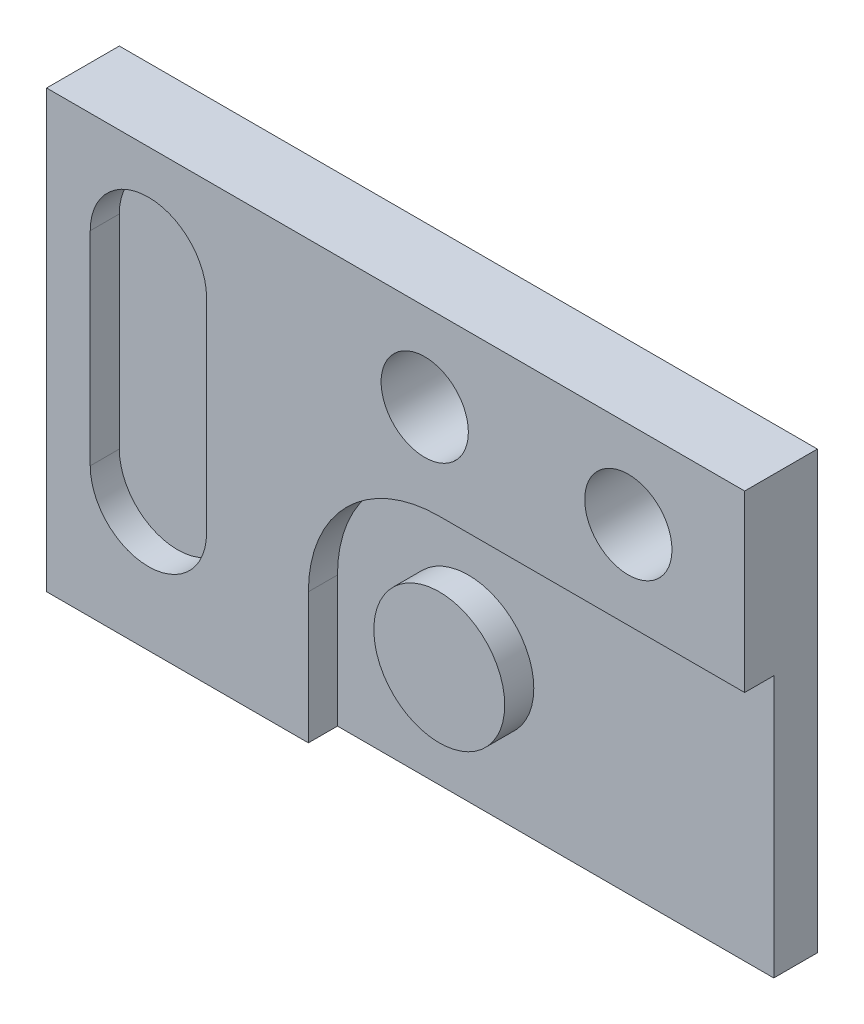
ISO-10303-21;
HEADER;
FILE_DESCRIPTION(('STEP AP214'),'2;1');
FILE_NAME('part.step','',(''),(''),'','','');
FILE_SCHEMA(('AUTOMOTIVE_DESIGN { 1 0 10303 214 1 1 1 1 }'));
ENDSEC;
DATA;
#1=APPLICATION_CONTEXT('core data for automotive mechanical design processes');
#2=APPLICATION_PROTOCOL_DEFINITION('international standard','automotive_design',2000,#1);
#3=PRODUCT_CONTEXT('',#1,'mechanical');
#4=PRODUCT('Part','Part','',(#3));
#5=PRODUCT_RELATED_PRODUCT_CATEGORY('part','',(#4));
#6=PRODUCT_DEFINITION_FORMATION('','',#4);
#7=PRODUCT_DEFINITION_CONTEXT('part definition',#1,'design');
#8=PRODUCT_DEFINITION('design','',#6,#7);
#9=PRODUCT_DEFINITION_SHAPE('','',#8);
#10=(LENGTH_UNIT() NAMED_UNIT(*) SI_UNIT(.MILLI.,.METRE.));
#11=(NAMED_UNIT(*) PLANE_ANGLE_UNIT() SI_UNIT($,.RADIAN.));
#12=(NAMED_UNIT(*) SI_UNIT($,.STERADIAN.) SOLID_ANGLE_UNIT());
#13=UNCERTAINTY_MEASURE_WITH_UNIT(LENGTH_MEASURE(1.E-05),#10,'distance_accuracy_value','');
#14=(GEOMETRIC_REPRESENTATION_CONTEXT(3) GLOBAL_UNCERTAINTY_ASSIGNED_CONTEXT((#13)) GLOBAL_UNIT_ASSIGNED_CONTEXT((#10,
#11,#12)) REPRESENTATION_CONTEXT('',''));
#15=CARTESIAN_POINT('',(0.,0.,0.));
#16=DIRECTION('',(0.,0.,1.));
#17=DIRECTION('',(1.,0.,0.));
#18=AXIS2_PLACEMENT_3D('',#15,#16,#17);
#19=CARTESIAN_POINT('',(120.,-75.,25.));
#20=DIRECTION('',(-1.,0.,0.));
#21=DIRECTION('',(0.,0.,1.));
#22=AXIS2_PLACEMENT_3D('',#19,#20,#21);
#23=PLANE('',#22);
#24=DIRECTION('',(0.,1.,0.));
#25=VECTOR('',#24,1.);
#26=CARTESIAN_POINT('',(120.,-75.,25.));
#27=LINE('',#26,#25);
#28=CARTESIAN_POINT('',(120.,15.,25.));
#29=VERTEX_POINT('',#28);
#30=CARTESIAN_POINT('',(120.,75.,25.));
#31=VERTEX_POINT('',#30);
#32=EDGE_CURVE('E293',#29,#31,#27,.T.);
#33=ORIENTED_EDGE('',*,*,#32,.F.);
#34=DIRECTION('',(0.,0.,1.));
#35=VECTOR('',#34,1.);
#36=CARTESIAN_POINT('',(120.,15.,15.));
#37=LINE('',#36,#35);
#38=CARTESIAN_POINT('',(120.,15.,15.));
#39=VERTEX_POINT('',#38);
#40=EDGE_CURVE('E71',#39,#29,#37,.T.);
#41=ORIENTED_EDGE('',*,*,#40,.F.);
#42=DIRECTION('',(0.,1.,0.));
#43=VECTOR('',#42,1.);
#44=CARTESIAN_POINT('',(120.,15.,15.));
#45=LINE('',#44,#43);
#46=CARTESIAN_POINT('',(120.,-75.,15.));
#47=VERTEX_POINT('',#46);
#48=EDGE_CURVE('E241',#47,#39,#45,.T.);
#49=ORIENTED_EDGE('',*,*,#48,.F.);
#50=DIRECTION('',(0.,0.,-1.));
#51=VECTOR('',#50,1.);
#52=CARTESIAN_POINT('',(120.,-75.,25.));
#53=LINE('',#52,#51);
#54=CARTESIAN_POINT('',(120.,-75.,0.));
#55=VERTEX_POINT('',#54);
#56=EDGE_CURVE('E309',#47,#55,#53,.T.);
#57=ORIENTED_EDGE('',*,*,#56,.T.);
#58=DIRECTION('',(0.,1.,0.));
#59=VECTOR('',#58,1.);
#60=CARTESIAN_POINT('',(120.,-75.,0.));
#61=LINE('',#60,#59);
#62=CARTESIAN_POINT('',(120.,75.,0.));
#63=VERTEX_POINT('',#62);
#64=EDGE_CURVE('E208',#55,#63,#61,.T.);
#65=ORIENTED_EDGE('',*,*,#64,.T.);
#66=DIRECTION('',(0.,0.,-1.));
#67=VECTOR('',#66,1.);
#68=CARTESIAN_POINT('',(120.,75.,25.));
#69=LINE('',#68,#67);
#70=EDGE_CURVE('E12',#31,#63,#69,.T.);
#71=ORIENTED_EDGE('',*,*,#70,.F.);
#72=EDGE_LOOP('',(#33,#41,#49,#57,#65,#71));
#73=FACE_BOUND('',#72,.T.);
#74=ADVANCED_FACE('F47',(#73),#23,.F.);
#75=CARTESIAN_POINT('',(-120.,75.,25.));
#76=DIRECTION('',(0.,-1.,0.));
#77=DIRECTION('',(0.,0.,-1.));
#78=AXIS2_PLACEMENT_3D('',#75,#76,#77);
#79=PLANE('',#78);
#80=DIRECTION('',(-1.,0.,0.));
#81=VECTOR('',#80,1.);
#82=CARTESIAN_POINT('',(-120.,75.,0.));
#83=LINE('',#82,#81);
#84=CARTESIAN_POINT('',(-120.,75.,0.));
#85=VERTEX_POINT('',#84);
#86=EDGE_CURVE('E314',#63,#85,#83,.T.);
#87=ORIENTED_EDGE('',*,*,#86,.T.);
#88=DIRECTION('',(0.,0.,-1.));
#89=VECTOR('',#88,1.);
#90=CARTESIAN_POINT('',(-120.,75.,25.));
#91=LINE('',#90,#89);
#92=CARTESIAN_POINT('',(-120.,75.,25.));
#93=VERTEX_POINT('',#92);
#94=EDGE_CURVE('E56',#93,#85,#91,.T.);
#95=ORIENTED_EDGE('',*,*,#94,.F.);
#96=DIRECTION('',(-1.,0.,0.));
#97=VECTOR('',#96,1.);
#98=CARTESIAN_POINT('',(-120.,75.,25.));
#99=LINE('',#98,#97);
#100=EDGE_CURVE('E297',#31,#93,#99,.T.);
#101=ORIENTED_EDGE('',*,*,#100,.F.);
#102=ORIENTED_EDGE('',*,*,#70,.T.);
#103=EDGE_LOOP('',(#87,#95,#101,#102));
#104=FACE_BOUND('',#103,.T.);
#105=ADVANCED_FACE('F347',(#104),#79,.F.);
#106=CARTESIAN_POINT('',(-120.,-75.,25.));
#107=DIRECTION('',(1.,0.,0.));
#108=DIRECTION('',(0.,0.,-1.));
#109=AXIS2_PLACEMENT_3D('',#106,#107,#108);
#110=PLANE('',#109);
#111=DIRECTION('',(0.,-1.,0.));
#112=VECTOR('',#111,1.);
#113=CARTESIAN_POINT('',(-120.,-75.,0.));
#114=LINE('',#113,#112);
#115=CARTESIAN_POINT('',(-120.,-75.,0.));
#116=VERTEX_POINT('',#115);
#117=EDGE_CURVE('E336',#85,#116,#114,.T.);
#118=ORIENTED_EDGE('',*,*,#117,.T.);
#119=DIRECTION('',(0.,0.,-1.));
#120=VECTOR('',#119,1.);
#121=CARTESIAN_POINT('',(-120.,-75.,25.));
#122=LINE('',#121,#120);
#123=CARTESIAN_POINT('',(-120.,-75.,25.));
#124=VERTEX_POINT('',#123);
#125=EDGE_CURVE('E323',#124,#116,#122,.T.);
#126=ORIENTED_EDGE('',*,*,#125,.F.);
#127=DIRECTION('',(0.,-1.,0.));
#128=VECTOR('',#127,1.);
#129=CARTESIAN_POINT('',(-120.,-75.,25.));
#130=LINE('',#129,#128);
#131=EDGE_CURVE('E302',#93,#124,#130,.T.);
#132=ORIENTED_EDGE('',*,*,#131,.F.);
#133=ORIENTED_EDGE('',*,*,#94,.T.);
#134=EDGE_LOOP('',(#118,#126,#132,#133));
#135=FACE_BOUND('',#134,.T.);
#136=ADVANCED_FACE('F334',(#135),#110,.F.);
#137=CARTESIAN_POINT('',(-120.,-75.,25.));
#138=DIRECTION('',(0.,1.,0.));
#139=DIRECTION('',(0.,0.,1.));
#140=AXIS2_PLACEMENT_3D('',#137,#138,#139);
#141=PLANE('',#140);
#142=DIRECTION('',(1.,0.,0.));
#143=VECTOR('',#142,1.);
#144=CARTESIAN_POINT('',(-30.,-75.,15.));
#145=LINE('',#144,#143);
#146=CARTESIAN_POINT('',(-30.,-75.,15.));
#147=VERTEX_POINT('',#146);
#148=EDGE_CURVE('E246',#147,#47,#145,.T.);
#149=ORIENTED_EDGE('',*,*,#148,.F.);
#150=DIRECTION('',(0.,0.,1.));
#151=VECTOR('',#150,1.);
#152=CARTESIAN_POINT('',(-30.,-75.,15.));
#153=LINE('',#152,#151);
#154=CARTESIAN_POINT('',(-30.,-75.,25.));
#155=VERTEX_POINT('',#154);
#156=EDGE_CURVE('E227',#147,#155,#153,.T.);
#157=ORIENTED_EDGE('',*,*,#156,.T.);
#158=DIRECTION('',(1.,0.,0.));
#159=VECTOR('',#158,1.);
#160=CARTESIAN_POINT('',(-120.,-75.,25.));
#161=LINE('',#160,#159);
#162=EDGE_CURVE('E304',#124,#155,#161,.T.);
#163=ORIENTED_EDGE('',*,*,#162,.F.);
#164=ORIENTED_EDGE('',*,*,#125,.T.);
#165=DIRECTION('',(1.,0.,0.));
#166=VECTOR('',#165,1.);
#167=CARTESIAN_POINT('',(-120.,-75.,0.));
#168=LINE('',#167,#166);
#169=EDGE_CURVE('E298',#116,#55,#168,.T.);
#170=ORIENTED_EDGE('',*,*,#169,.T.);
#171=ORIENTED_EDGE('',*,*,#56,.F.);
#172=EDGE_LOOP('',(#149,#157,#163,#164,#170,#171));
#173=FACE_BOUND('',#172,.T.);
#174=ADVANCED_FACE('F355',(#173),#141,.F.);
#175=CARTESIAN_POINT('',(0.,0.,25.));
#176=DIRECTION('',(0.,0.,-1.));
#177=DIRECTION('',(-1.,0.,0.));
#178=AXIS2_PLACEMENT_3D('',#175,#176,#177);
#179=PLANE('',#178);
#180=DIRECTION('',(0.,1.,0.));
#181=VECTOR('',#180,1.);
#182=CARTESIAN_POINT('',(-64.9999999999995,-29.9999999999999,25.));
#183=LINE('',#182,#181);
#184=CARTESIAN_POINT('',(-64.9999999999995,-29.9999999999999,25.));
#185=VERTEX_POINT('',#184);
#186=CARTESIAN_POINT('',(-65.0000000000001,40.0000000000001,25.));
#187=VERTEX_POINT('',#186);
#188=EDGE_CURVE('E190',#185,#187,#183,.T.);
#189=ORIENTED_EDGE('',*,*,#188,.F.);
#190=CARTESIAN_POINT('',(-84.9999999999995,-30.,25.));
#191=DIRECTION('',(0.,0.,1.));
#192=DIRECTION('',(1.,0.,0.));
#193=AXIS2_PLACEMENT_3D('',#190,#191,#192);
#194=CIRCLE('',#193,20.);
#195=CARTESIAN_POINT('',(-105.,-30.0000000000002,25.));
#196=VERTEX_POINT('',#195);
#197=EDGE_CURVE('E63',#196,#185,#194,.T.);
#198=ORIENTED_EDGE('',*,*,#197,.F.);
#199=DIRECTION('',(0.,-1.,0.));
#200=VECTOR('',#199,1.);
#201=CARTESIAN_POINT('',(-105.,-30.0000000000002,25.));
#202=LINE('',#201,#200);
#203=CARTESIAN_POINT('',(-105.,39.9999999999999,25.));
#204=VERTEX_POINT('',#203);
#205=EDGE_CURVE('E162',#204,#196,#202,.T.);
#206=ORIENTED_EDGE('',*,*,#205,.F.);
#207=CARTESIAN_POINT('',(-85.,40.,25.));
#208=DIRECTION('',(0.,0.,1.));
#209=DIRECTION('',(1.,0.,0.));
#210=AXIS2_PLACEMENT_3D('',#207,#208,#209);
#211=CIRCLE('',#210,20.);
#212=EDGE_CURVE('E166',#187,#204,#211,.T.);
#213=ORIENTED_EDGE('',*,*,#212,.F.);
#214=EDGE_LOOP('',(#189,#198,#206,#213));
#215=FACE_BOUND('',#214,.T.);
#216=CARTESIAN_POINT('',(9.99999999999995,45.,25.));
#217=DIRECTION('',(0.,0.,1.));
#218=DIRECTION('',(1.,0.,0.));
#219=AXIS2_PLACEMENT_3D('',#216,#217,#218);
#220=CIRCLE('',#219,15.);
#221=CARTESIAN_POINT('',(25.,45.,25.));
#222=VERTEX_POINT('',#221);
#223=EDGE_CURVE('E191',#222,#222,#220,.T.);
#224=ORIENTED_EDGE('',*,*,#223,.F.);
#225=EDGE_LOOP('',(#224));
#226=FACE_BOUND('',#225,.T.);
#227=CARTESIAN_POINT('',(80.,45.,25.));
#228=DIRECTION('',(0.,0.,1.));
#229=DIRECTION('',(1.,0.,0.));
#230=AXIS2_PLACEMENT_3D('',#227,#228,#229);
#231=CIRCLE('',#230,15.);
#232=CARTESIAN_POINT('',(95.,45.,25.));
#233=VERTEX_POINT('',#232);
#234=EDGE_CURVE('E223',#233,#233,#231,.T.);
#235=ORIENTED_EDGE('',*,*,#234,.F.);
#236=EDGE_LOOP('',(#235));
#237=FACE_BOUND('',#236,.T.);
#238=ORIENTED_EDGE('',*,*,#162,.T.);
#239=DIRECTION('',(0.,-1.,0.));
#240=VECTOR('',#239,1.);
#241=CARTESIAN_POINT('',(-30.,-30.,25.));
#242=LINE('',#241,#240);
#243=CARTESIAN_POINT('',(-30.,-30.,25.));
#244=VERTEX_POINT('',#243);
#245=EDGE_CURVE('E273',#244,#155,#242,.T.);
#246=ORIENTED_EDGE('',*,*,#245,.F.);
#247=CARTESIAN_POINT('',(15.,-30.,25.));
#248=DIRECTION('',(0.,0.,1.));
#249=DIRECTION('',(1.,0.,0.));
#250=AXIS2_PLACEMENT_3D('',#247,#248,#249);
#251=CIRCLE('',#250,45.);
#252=CARTESIAN_POINT('',(15.,15.,25.));
#253=VERTEX_POINT('',#252);
#254=EDGE_CURVE('E268',#253,#244,#251,.T.);
#255=ORIENTED_EDGE('',*,*,#254,.F.);
#256=DIRECTION('',(-1.,0.,0.));
#257=VECTOR('',#256,1.);
#258=CARTESIAN_POINT('',(15.,15.,25.));
#259=LINE('',#258,#257);
#260=EDGE_CURVE('E232',#29,#253,#259,.T.);
#261=ORIENTED_EDGE('',*,*,#260,.F.);
#262=ORIENTED_EDGE('',*,*,#32,.T.);
#263=ORIENTED_EDGE('',*,*,#100,.T.);
#264=ORIENTED_EDGE('',*,*,#131,.T.);
#265=EDGE_LOOP('',(#238,#246,#255,#261,#262,#263,#264));
#266=FACE_BOUND('',#265,.T.);
#267=ADVANCED_FACE('F359',(#215,#226,#237,#266),#179,.F.);
#268=CARTESIAN_POINT('',(0.,0.,0.));
#269=DIRECTION('',(0.,0.,-1.));
#270=DIRECTION('',(-1.,0.,0.));
#271=AXIS2_PLACEMENT_3D('',#268,#269,#270);
#272=PLANE('',#271);
#273=CARTESIAN_POINT('',(9.99999999999995,45.,0.));
#274=DIRECTION('',(0.,0.,1.));
#275=DIRECTION('',(1.,0.,0.));
#276=AXIS2_PLACEMENT_3D('',#273,#274,#275);
#277=CIRCLE('',#276,15.);
#278=CARTESIAN_POINT('',(25.,45.,0.));
#279=VERTEX_POINT('',#278);
#280=EDGE_CURVE('E617',#279,#279,#277,.T.);
#281=ORIENTED_EDGE('',*,*,#280,.T.);
#282=EDGE_LOOP('',(#281));
#283=FACE_BOUND('',#282,.T.);
#284=CARTESIAN_POINT('',(80.,45.,0.));
#285=DIRECTION('',(0.,0.,1.));
#286=DIRECTION('',(1.,0.,0.));
#287=AXIS2_PLACEMENT_3D('',#284,#285,#286);
#288=CIRCLE('',#287,15.);
#289=CARTESIAN_POINT('',(95.,45.,0.));
#290=VERTEX_POINT('',#289);
#291=EDGE_CURVE('E170',#290,#290,#288,.T.);
#292=ORIENTED_EDGE('',*,*,#291,.T.);
#293=EDGE_LOOP('',(#292));
#294=FACE_BOUND('',#293,.T.);
#295=ORIENTED_EDGE('',*,*,#64,.F.);
#296=ORIENTED_EDGE('',*,*,#169,.F.);
#297=ORIENTED_EDGE('',*,*,#117,.F.);
#298=ORIENTED_EDGE('',*,*,#86,.F.);
#299=EDGE_LOOP('',(#295,#296,#297,#298));
#300=FACE_BOUND('',#299,.T.);
#301=ADVANCED_FACE('F342',(#283,#294,#300),#272,.T.);
#302=CARTESIAN_POINT('',(-30.,-30.,15.));
#303=DIRECTION('',(-1.,0.,0.));
#304=DIRECTION('',(0.,-1.,0.));
#305=AXIS2_PLACEMENT_3D('',#302,#303,#304);
#306=PLANE('',#305);
#307=ORIENTED_EDGE('',*,*,#245,.T.);
#308=ORIENTED_EDGE('',*,*,#156,.F.);
#309=DIRECTION('',(0.,-1.,0.));
#310=VECTOR('',#309,1.);
#311=CARTESIAN_POINT('',(-30.,-30.,15.));
#312=LINE('',#311,#310);
#313=CARTESIAN_POINT('',(-30.,-30.,15.));
#314=VERTEX_POINT('',#313);
#315=EDGE_CURVE('E257',#314,#147,#312,.T.);
#316=ORIENTED_EDGE('',*,*,#315,.F.);
#317=DIRECTION('',(0.,0.,1.));
#318=VECTOR('',#317,1.);
#319=CARTESIAN_POINT('',(-30.,-30.,15.));
#320=LINE('',#319,#318);
#321=EDGE_CURVE('E281',#314,#244,#320,.T.);
#322=ORIENTED_EDGE('',*,*,#321,.T.);
#323=EDGE_LOOP('',(#307,#308,#316,#322));
#324=FACE_BOUND('',#323,.T.);
#325=ADVANCED_FACE('F403',(#324),#306,.F.);
#326=CARTESIAN_POINT('',(15.,-30.,15.));
#327=DIRECTION('',(0.,0.,1.));
#328=DIRECTION('',(1.,0.,0.));
#329=AXIS2_PLACEMENT_3D('',#326,#327,#328);
#330=CYLINDRICAL_SURFACE('',#329,45.);
#331=ORIENTED_EDGE('',*,*,#254,.T.);
#332=ORIENTED_EDGE('',*,*,#321,.F.);
#333=CARTESIAN_POINT('',(15.,-30.,15.));
#334=DIRECTION('',(0.,0.,1.));
#335=DIRECTION('',(1.,0.,0.));
#336=AXIS2_PLACEMENT_3D('',#333,#334,#335);
#337=CIRCLE('',#336,45.);
#338=CARTESIAN_POINT('',(15.,15.,15.));
#339=VERTEX_POINT('',#338);
#340=EDGE_CURVE('E252',#339,#314,#337,.T.);
#341=ORIENTED_EDGE('',*,*,#340,.F.);
#342=DIRECTION('',(0.,0.,1.));
#343=VECTOR('',#342,1.);
#344=CARTESIAN_POINT('',(15.,15.,15.));
#345=LINE('',#344,#343);
#346=EDGE_CURVE('E362',#339,#253,#345,.T.);
#347=ORIENTED_EDGE('',*,*,#346,.T.);
#348=EDGE_LOOP('',(#331,#332,#341,#347));
#349=FACE_BOUND('',#348,.T.);
#350=ADVANCED_FACE('F414',(#349),#330,.F.);
#351=CARTESIAN_POINT('',(15.,15.,15.));
#352=DIRECTION('',(0.,1.,0.));
#353=DIRECTION('',(0.,0.,1.));
#354=AXIS2_PLACEMENT_3D('',#351,#352,#353);
#355=PLANE('',#354);
#356=ORIENTED_EDGE('',*,*,#260,.T.);
#357=ORIENTED_EDGE('',*,*,#346,.F.);
#358=DIRECTION('',(-1.,0.,0.));
#359=VECTOR('',#358,1.);
#360=CARTESIAN_POINT('',(15.,15.,15.));
#361=LINE('',#360,#359);
#362=EDGE_CURVE('E245',#39,#339,#361,.T.);
#363=ORIENTED_EDGE('',*,*,#362,.F.);
#364=ORIENTED_EDGE('',*,*,#40,.T.);
#365=EDGE_LOOP('',(#356,#357,#363,#364));
#366=FACE_BOUND('',#365,.T.);
#367=ADVANCED_FACE('F422',(#366),#355,.F.);
#368=CARTESIAN_POINT('',(15.,-30.,15.));
#369=DIRECTION('',(0.,0.,1.));
#370=DIRECTION('',(1.,0.,0.));
#371=AXIS2_PLACEMENT_3D('',#368,#369,#370);
#372=PLANE('',#371);
#373=CARTESIAN_POINT('',(15.,-30.,15.));
#374=DIRECTION('',(0.,0.,1.));
#375=DIRECTION('',(1.,0.,0.));
#376=AXIS2_PLACEMENT_3D('',#373,#374,#375);
#377=CIRCLE('',#376,22.5);
#378=CARTESIAN_POINT('',(37.5,-30.,15.));
#379=VERTEX_POINT('',#378);
#380=EDGE_CURVE('E228',#379,#379,#377,.T.);
#381=ORIENTED_EDGE('',*,*,#380,.F.);
#382=EDGE_LOOP('',(#381));
#383=FACE_BOUND('',#382,.T.);
#384=ORIENTED_EDGE('',*,*,#148,.T.);
#385=ORIENTED_EDGE('',*,*,#48,.T.);
#386=ORIENTED_EDGE('',*,*,#362,.T.);
#387=ORIENTED_EDGE('',*,*,#340,.T.);
#388=ORIENTED_EDGE('',*,*,#315,.T.);
#389=EDGE_LOOP('',(#384,#385,#386,#387,#388));
#390=FACE_BOUND('',#389,.T.);
#391=ADVANCED_FACE('F370',(#383,#390),#372,.T.);
#392=CARTESIAN_POINT('',(15.,-30.,15.));
#393=DIRECTION('',(0.,0.,1.));
#394=DIRECTION('',(1.,0.,0.));
#395=AXIS2_PLACEMENT_3D('',#392,#393,#394);
#396=CYLINDRICAL_SURFACE('',#395,22.5);
#397=ORIENTED_EDGE('',*,*,#380,.T.);
#398=EDGE_LOOP('',(#397));
#399=FACE_BOUND('',#398,.T.);
#400=CARTESIAN_POINT('',(15.,-30.,25.));
#401=DIRECTION('',(0.,0.,1.));
#402=DIRECTION('',(1.,0.,0.));
#403=AXIS2_PLACEMENT_3D('',#400,#401,#402);
#404=CIRCLE('',#403,22.5);
#405=CARTESIAN_POINT('',(37.5,-30.,25.));
#406=VERTEX_POINT('',#405);
#407=EDGE_CURVE('E233',#406,#406,#404,.T.);
#408=ORIENTED_EDGE('',*,*,#407,.F.);
#409=EDGE_LOOP('',(#408));
#410=FACE_BOUND('',#409,.T.);
#411=ADVANCED_FACE('F439',(#399,#410),#396,.T.);
#412=CARTESIAN_POINT('',(80.,45.,15.));
#413=DIRECTION('',(0.,0.,1.));
#414=DIRECTION('',(1.,0.,0.));
#415=AXIS2_PLACEMENT_3D('',#412,#413,#414);
#416=CYLINDRICAL_SURFACE('',#415,15.);
#417=ORIENTED_EDGE('',*,*,#234,.T.);
#418=EDGE_LOOP('',(#417));
#419=FACE_BOUND('',#418,.T.);
#420=ORIENTED_EDGE('',*,*,#291,.F.);
#421=EDGE_LOOP('',(#420));
#422=FACE_BOUND('',#421,.T.);
#423=ADVANCED_FACE('F449',(#419,#422),#416,.F.);
#424=CARTESIAN_POINT('',(9.99999999999995,45.,15.));
#425=DIRECTION('',(0.,0.,1.));
#426=DIRECTION('',(1.,0.,0.));
#427=AXIS2_PLACEMENT_3D('',#424,#425,#426);
#428=CYLINDRICAL_SURFACE('',#427,15.);
#429=ORIENTED_EDGE('',*,*,#223,.T.);
#430=EDGE_LOOP('',(#429));
#431=FACE_BOUND('',#430,.T.);
#432=ORIENTED_EDGE('',*,*,#280,.F.);
#433=EDGE_LOOP('',(#432));
#434=FACE_BOUND('',#433,.T.);
#435=ADVANCED_FACE('F457',(#431,#434),#428,.F.);
#436=CARTESIAN_POINT('',(-84.9999999999995,-30.,15.));
#437=DIRECTION('',(0.,0.,1.));
#438=DIRECTION('',(1.,0.,0.));
#439=AXIS2_PLACEMENT_3D('',#436,#437,#438);
#440=CYLINDRICAL_SURFACE('',#439,20.);
#441=ORIENTED_EDGE('',*,*,#197,.T.);
#442=DIRECTION('',(0.,0.,1.));
#443=VECTOR('',#442,1.);
#444=CARTESIAN_POINT('',(-64.9999999999995,-29.9999999999999,15.));
#445=LINE('',#444,#443);
#446=CARTESIAN_POINT('',(-64.9999999999995,-29.9999999999999,15.));
#447=VERTEX_POINT('',#446);
#448=EDGE_CURVE('E136',#447,#185,#445,.T.);
#449=ORIENTED_EDGE('',*,*,#448,.F.);
#450=CARTESIAN_POINT('',(-84.9999999999995,-30.,15.));
#451=DIRECTION('',(0.,0.,1.));
#452=DIRECTION('',(1.,0.,0.));
#453=AXIS2_PLACEMENT_3D('',#450,#451,#452);
#454=CIRCLE('',#453,20.);
#455=CARTESIAN_POINT('',(-105.,-30.0000000000002,15.));
#456=VERTEX_POINT('',#455);
#457=EDGE_CURVE('E140',#456,#447,#454,.T.);
#458=ORIENTED_EDGE('',*,*,#457,.F.);
#459=DIRECTION('',(0.,0.,1.));
#460=VECTOR('',#459,1.);
#461=CARTESIAN_POINT('',(-105.,-30.0000000000002,15.));
#462=LINE('',#461,#460);
#463=EDGE_CURVE('E204',#456,#196,#462,.T.);
#464=ORIENTED_EDGE('',*,*,#463,.T.);
#465=EDGE_LOOP('',(#441,#449,#458,#464));
#466=FACE_BOUND('',#465,.T.);
#467=ADVANCED_FACE('F138',(#466),#440,.F.);
#468=CARTESIAN_POINT('',(-105.,-30.0000000000002,15.));
#469=DIRECTION('',(-1.,0.,0.));
#470=DIRECTION('',(0.,-1.,0.));
#471=AXIS2_PLACEMENT_3D('',#468,#469,#470);
#472=PLANE('',#471);
#473=ORIENTED_EDGE('',*,*,#205,.T.);
#474=ORIENTED_EDGE('',*,*,#463,.F.);
#475=DIRECTION('',(0.,-1.,0.));
#476=VECTOR('',#475,1.);
#477=CARTESIAN_POINT('',(-105.,-30.0000000000002,15.));
#478=LINE('',#477,#476);
#479=CARTESIAN_POINT('',(-105.,39.9999999999999,15.));
#480=VERTEX_POINT('',#479);
#481=EDGE_CURVE('E147',#480,#456,#478,.T.);
#482=ORIENTED_EDGE('',*,*,#481,.F.);
#483=DIRECTION('',(0.,0.,1.));
#484=VECTOR('',#483,1.);
#485=CARTESIAN_POINT('',(-105.,39.9999999999999,15.));
#486=LINE('',#485,#484);
#487=EDGE_CURVE('E209',#480,#204,#486,.T.);
#488=ORIENTED_EDGE('',*,*,#487,.T.);
#489=EDGE_LOOP('',(#473,#474,#482,#488));
#490=FACE_BOUND('',#489,.T.);
#491=ADVANCED_FACE('F474',(#490),#472,.F.);
#492=CARTESIAN_POINT('',(-85.,40.,15.));
#493=DIRECTION('',(0.,0.,1.));
#494=DIRECTION('',(1.,0.,0.));
#495=AXIS2_PLACEMENT_3D('',#492,#493,#494);
#496=CYLINDRICAL_SURFACE('',#495,20.);
#497=ORIENTED_EDGE('',*,*,#212,.T.);
#498=ORIENTED_EDGE('',*,*,#487,.F.);
#499=CARTESIAN_POINT('',(-85.,40.,15.));
#500=DIRECTION('',(0.,0.,1.));
#501=DIRECTION('',(1.,0.,0.));
#502=AXIS2_PLACEMENT_3D('',#499,#500,#501);
#503=CIRCLE('',#502,20.);
#504=CARTESIAN_POINT('',(-65.0000000000001,40.0000000000001,15.));
#505=VERTEX_POINT('',#504);
#506=EDGE_CURVE('E156',#505,#480,#503,.T.);
#507=ORIENTED_EDGE('',*,*,#506,.F.);
#508=DIRECTION('',(0.,0.,1.));
#509=VECTOR('',#508,1.);
#510=CARTESIAN_POINT('',(-65.0000000000001,40.0000000000001,15.));
#511=LINE('',#510,#509);
#512=EDGE_CURVE('E146',#505,#187,#511,.T.);
#513=ORIENTED_EDGE('',*,*,#512,.T.);
#514=EDGE_LOOP('',(#497,#498,#507,#513));
#515=FACE_BOUND('',#514,.T.);
#516=ADVANCED_FACE('F483',(#515),#496,.F.);
#517=CARTESIAN_POINT('',(-64.9999999999995,-29.9999999999999,15.));
#518=DIRECTION('',(1.,0.,0.));
#519=DIRECTION('',(0.,1.,0.));
#520=AXIS2_PLACEMENT_3D('',#517,#518,#519);
#521=PLANE('',#520);
#522=ORIENTED_EDGE('',*,*,#188,.T.);
#523=ORIENTED_EDGE('',*,*,#512,.F.);
#524=DIRECTION('',(0.,1.,0.));
#525=VECTOR('',#524,1.);
#526=CARTESIAN_POINT('',(-64.9999999999995,-29.9999999999999,15.));
#527=LINE('',#526,#525);
#528=EDGE_CURVE('E150',#447,#505,#527,.T.);
#529=ORIENTED_EDGE('',*,*,#528,.F.);
#530=ORIENTED_EDGE('',*,*,#448,.T.);
#531=EDGE_LOOP('',(#522,#523,#529,#530));
#532=FACE_BOUND('',#531,.T.);
#533=ADVANCED_FACE('F151',(#532),#521,.F.);
#534=CARTESIAN_POINT('',(-84.9999999999995,-30.,15.));
#535=DIRECTION('',(0.,0.,1.));
#536=DIRECTION('',(1.,0.,0.));
#537=AXIS2_PLACEMENT_3D('',#534,#535,#536);
#538=PLANE('',#537);
#539=ORIENTED_EDGE('',*,*,#457,.T.);
#540=ORIENTED_EDGE('',*,*,#528,.T.);
#541=ORIENTED_EDGE('',*,*,#506,.T.);
#542=ORIENTED_EDGE('',*,*,#481,.T.);
#543=EDGE_LOOP('',(#539,#540,#541,#542));
#544=FACE_BOUND('',#543,.T.);
#545=ADVANCED_FACE('F159',(#544),#538,.T.);
#546=ORIENTED_EDGE('',*,*,#407,.T.);
#547=EDGE_LOOP('',(#546));
#548=FACE_BOUND('',#547,.T.);
#549=ADVANCED_FACE('F389',(#548),#179,.F.);
#550=CLOSED_SHELL('',(#74,#105,#136,#174,#267,#301,#325,#350,#367,#391,#411,#423,#435,#467,#491,
#516,#533,#545,#549));
#551=MANIFOLD_SOLID_BREP('B2',#550);
#552=ADVANCED_BREP_SHAPE_REPRESENTATION('',(#18,#551),#14);
#553=SHAPE_DEFINITION_REPRESENTATION(#9,#552);
ENDSEC;
END-ISO-10303-21;
